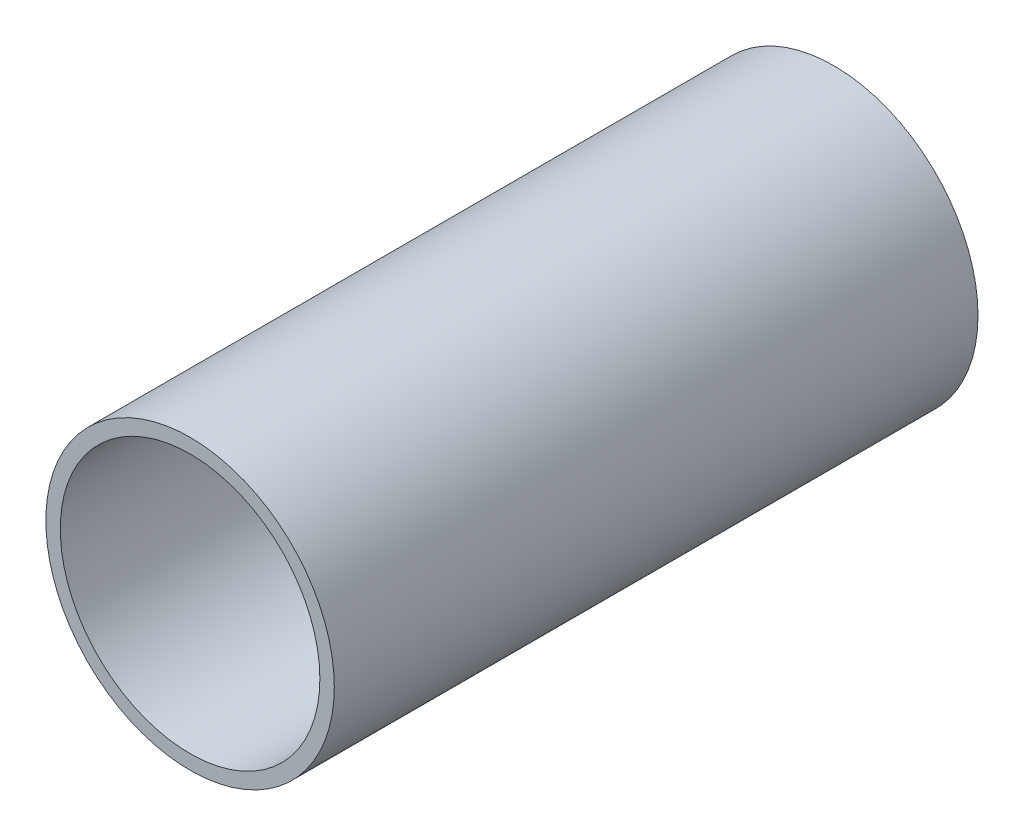
ISO-10303-21;
HEADER;
FILE_DESCRIPTION(('STEP AP214'),'2;1');
FILE_NAME('part.step','',(''),(''),'','','');
FILE_SCHEMA(('AUTOMOTIVE_DESIGN { 1 0 10303 214 1 1 1 1 }'));
ENDSEC;
DATA;
#1=APPLICATION_CONTEXT('core data for automotive mechanical design processes');
#2=APPLICATION_PROTOCOL_DEFINITION('international standard','automotive_design',2000,#1);
#3=PRODUCT_CONTEXT('',#1,'mechanical');
#4=PRODUCT('Part','Part','',(#3));
#5=PRODUCT_RELATED_PRODUCT_CATEGORY('part','',(#4));
#6=PRODUCT_DEFINITION_FORMATION('','',#4);
#7=PRODUCT_DEFINITION_CONTEXT('part definition',#1,'design');
#8=PRODUCT_DEFINITION('design','',#6,#7);
#9=PRODUCT_DEFINITION_SHAPE('','',#8);
#10=(LENGTH_UNIT() NAMED_UNIT(*) SI_UNIT(.MILLI.,.METRE.));
#11=(NAMED_UNIT(*) PLANE_ANGLE_UNIT() SI_UNIT($,.RADIAN.));
#12=(NAMED_UNIT(*) SI_UNIT($,.STERADIAN.) SOLID_ANGLE_UNIT());
#13=UNCERTAINTY_MEASURE_WITH_UNIT(LENGTH_MEASURE(1.E-05),#10,'distance_accuracy_value','');
#14=(GEOMETRIC_REPRESENTATION_CONTEXT(3) GLOBAL_UNCERTAINTY_ASSIGNED_CONTEXT((#13)) GLOBAL_UNIT_ASSIGNED_CONTEXT((#10,
#11,#12)) REPRESENTATION_CONTEXT('',''));
#15=CARTESIAN_POINT('',(0.,0.,0.));
#16=DIRECTION('',(0.,0.,1.));
#17=DIRECTION('',(1.,0.,0.));
#18=AXIS2_PLACEMENT_3D('',#15,#16,#17);
#19=CARTESIAN_POINT('',(0.,0.,89.2635));
#20=DIRECTION('',(0.,0.,1.));
#21=DIRECTION('',(1.,0.,0.));
#22=AXIS2_PLACEMENT_3D('',#19,#20,#21);
#23=PLANE('',#22);
#24=CARTESIAN_POINT('',(0.,0.,89.2635));
#25=DIRECTION('',(0.,0.,1.));
#26=DIRECTION('',(1.,0.,0.));
#27=AXIS2_PLACEMENT_3D('',#24,#25,#26);
#28=CIRCLE('',#27,20.);
#29=CARTESIAN_POINT('',(20.,0.,89.2635));
#30=VERTEX_POINT('',#29);
#31=EDGE_CURVE('E10',#30,#30,#28,.T.);
#32=ORIENTED_EDGE('',*,*,#31,.T.);
#33=EDGE_LOOP('',(#32));
#34=FACE_BOUND('',#33,.T.);
#35=CARTESIAN_POINT('',(0.,0.,89.2635));
#36=DIRECTION('',(0.,0.,1.));
#37=DIRECTION('',(1.,0.,0.));
#38=AXIS2_PLACEMENT_3D('',#35,#36,#37);
#39=CIRCLE('',#38,18.);
#40=CARTESIAN_POINT('',(18.,0.,89.2635));
#41=VERTEX_POINT('',#40);
#42=EDGE_CURVE('E50',#41,#41,#39,.T.);
#43=ORIENTED_EDGE('',*,*,#42,.F.);
#44=EDGE_LOOP('',(#43));
#45=FACE_BOUND('',#44,.T.);
#46=ADVANCED_FACE('F37',(#34,#45),#23,.T.);
#47=CARTESIAN_POINT('',(0.,0.,0.));
#48=DIRECTION('',(0.,0.,1.));
#49=DIRECTION('',(1.,0.,0.));
#50=AXIS2_PLACEMENT_3D('',#47,#48,#49);
#51=PLANE('',#50);
#52=CARTESIAN_POINT('',(0.,0.,0.));
#53=DIRECTION('',(0.,0.,1.));
#54=DIRECTION('',(1.,0.,0.));
#55=AXIS2_PLACEMENT_3D('',#52,#53,#54);
#56=CIRCLE('',#55,20.);
#57=CARTESIAN_POINT('',(20.,0.,0.));
#58=VERTEX_POINT('',#57);
#59=EDGE_CURVE('E41',#58,#58,#56,.T.);
#60=ORIENTED_EDGE('',*,*,#59,.F.);
#61=EDGE_LOOP('',(#60));
#62=FACE_BOUND('',#61,.T.);
#63=CARTESIAN_POINT('',(0.,0.,0.));
#64=DIRECTION('',(0.,0.,1.));
#65=DIRECTION('',(1.,0.,0.));
#66=AXIS2_PLACEMENT_3D('',#63,#64,#65);
#67=CIRCLE('',#66,18.);
#68=CARTESIAN_POINT('',(18.,0.,0.));
#69=VERTEX_POINT('',#68);
#70=EDGE_CURVE('E52',#69,#69,#67,.T.);
#71=ORIENTED_EDGE('',*,*,#70,.T.);
#72=EDGE_LOOP('',(#71));
#73=FACE_BOUND('',#72,.T.);
#74=ADVANCED_FACE('F64',(#62,#73),#51,.F.);
#75=CARTESIAN_POINT('',(0.,0.,89.2635));
#76=DIRECTION('',(0.,0.,-1.));
#77=DIRECTION('',(-1.,0.,0.));
#78=AXIS2_PLACEMENT_3D('',#75,#76,#77);
#79=CYLINDRICAL_SURFACE('',#78,20.);
#80=ORIENTED_EDGE('',*,*,#31,.F.);
#81=EDGE_LOOP('',(#80));
#82=FACE_BOUND('',#81,.T.);
#83=ORIENTED_EDGE('',*,*,#59,.T.);
#84=EDGE_LOOP('',(#83));
#85=FACE_BOUND('',#84,.T.);
#86=ADVANCED_FACE('F39',(#82,#85),#79,.T.);
#87=CARTESIAN_POINT('',(0.,0.,89.2635));
#88=DIRECTION('',(0.,0.,-1.));
#89=DIRECTION('',(-1.,0.,0.));
#90=AXIS2_PLACEMENT_3D('',#87,#88,#89);
#91=CYLINDRICAL_SURFACE('',#90,18.);
#92=ORIENTED_EDGE('',*,*,#42,.T.);
#93=EDGE_LOOP('',(#92));
#94=FACE_BOUND('',#93,.T.);
#95=ORIENTED_EDGE('',*,*,#70,.F.);
#96=EDGE_LOOP('',(#95));
#97=FACE_BOUND('',#96,.T.);
#98=ADVANCED_FACE('F60',(#94,#97),#91,.F.);
#99=CLOSED_SHELL('',(#46,#74,#86,#98));
#100=MANIFOLD_SOLID_BREP('B2',#99);
#101=ADVANCED_BREP_SHAPE_REPRESENTATION('',(#18,#100),#14);
#102=SHAPE_DEFINITION_REPRESENTATION(#9,#101);
ENDSEC;
END-ISO-10303-21;
